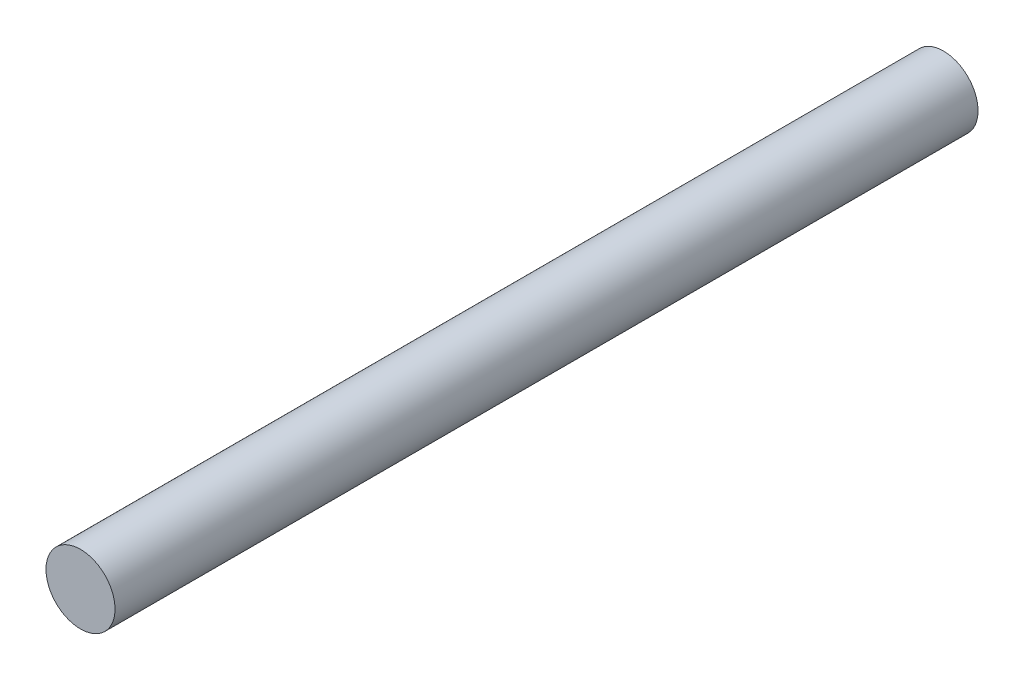
ISO-10303-21;
HEADER;
FILE_DESCRIPTION(('STEP AP214'),'2;1');
FILE_NAME('part.step','',(''),(''),'','','');
FILE_SCHEMA(('AUTOMOTIVE_DESIGN { 1 0 10303 214 1 1 1 1 }'));
ENDSEC;
DATA;
#1=APPLICATION_CONTEXT('core data for automotive mechanical design processes');
#2=APPLICATION_PROTOCOL_DEFINITION('international standard','automotive_design',2000,#1);
#3=PRODUCT_CONTEXT('',#1,'mechanical');
#4=PRODUCT('Part','Part','',(#3));
#5=PRODUCT_RELATED_PRODUCT_CATEGORY('part','',(#4));
#6=PRODUCT_DEFINITION_FORMATION('','',#4);
#7=PRODUCT_DEFINITION_CONTEXT('part definition',#1,'design');
#8=PRODUCT_DEFINITION('design','',#6,#7);
#9=PRODUCT_DEFINITION_SHAPE('','',#8);
#10=(LENGTH_UNIT() NAMED_UNIT(*) SI_UNIT(.MILLI.,.METRE.));
#11=(NAMED_UNIT(*) PLANE_ANGLE_UNIT() SI_UNIT($,.RADIAN.));
#12=(NAMED_UNIT(*) SI_UNIT($,.STERADIAN.) SOLID_ANGLE_UNIT());
#13=UNCERTAINTY_MEASURE_WITH_UNIT(LENGTH_MEASURE(1.E-05),#10,'distance_accuracy_value','');
#14=(GEOMETRIC_REPRESENTATION_CONTEXT(3) GLOBAL_UNCERTAINTY_ASSIGNED_CONTEXT((#13)) GLOBAL_UNIT_ASSIGNED_CONTEXT((#10,
#11,#12)) REPRESENTATION_CONTEXT('',''));
#15=CARTESIAN_POINT('',(0.,0.,0.));
#16=DIRECTION('',(0.,0.,1.));
#17=DIRECTION('',(1.,0.,0.));
#18=AXIS2_PLACEMENT_3D('',#15,#16,#17);
#19=CARTESIAN_POINT('',(0.2999994,0.,0.));
#20=DIRECTION('',(0.,0.,-1.));
#21=DIRECTION('',(-1.,0.,0.));
#22=AXIS2_PLACEMENT_3D('',#19,#20,#21);
#23=PLANE('',#22);
#24=CARTESIAN_POINT('',(0.,0.,0.));
#25=DIRECTION('',(0.,0.,-1.));
#26=DIRECTION('',(-1.,0.,0.));
#27=AXIS2_PLACEMENT_3D('',#24,#25,#26);
#28=CIRCLE('',#27,0.2999994);
#29=CARTESIAN_POINT('',(-0.2999994,0.,0.));
#30=VERTEX_POINT('',#29);
#31=EDGE_CURVE('E17',#30,#30,#28,.F.);
#32=ORIENTED_EDGE('',*,*,#31,.F.);
#33=EDGE_LOOP('',(#32));
#34=FACE_BOUND('',#33,.T.);
#35=ADVANCED_FACE('F14',(#34),#23,.T.);
#36=CARTESIAN_POINT('',(0.2999994,0.,7.50000024));
#37=DIRECTION('',(0.,0.,-1.));
#38=DIRECTION('',(-1.,0.,0.));
#39=AXIS2_PLACEMENT_3D('',#36,#37,#38);
#40=PLANE('',#39);
#41=CARTESIAN_POINT('',(0.,0.,7.50000024));
#42=DIRECTION('',(0.,0.,-1.));
#43=DIRECTION('',(-1.,0.,0.));
#44=AXIS2_PLACEMENT_3D('',#41,#42,#43);
#45=CIRCLE('',#44,0.2999994);
#46=CARTESIAN_POINT('',(-0.2999994,0.,7.50000024));
#47=VERTEX_POINT('',#46);
#48=EDGE_CURVE('E10',#47,#47,#45,.T.);
#49=ORIENTED_EDGE('',*,*,#48,.F.);
#50=EDGE_LOOP('',(#49));
#51=FACE_BOUND('',#50,.T.);
#52=ADVANCED_FACE('F29',(#51),#40,.F.);
#53=CARTESIAN_POINT('',(0.,0.,0.));
#54=DIRECTION('',(0.,0.,-1.));
#55=DIRECTION('',(-1.,0.,0.));
#56=AXIS2_PLACEMENT_3D('',#53,#54,#55);
#57=CYLINDRICAL_SURFACE('',#56,0.2999994);
#58=ORIENTED_EDGE('',*,*,#48,.T.);
#59=EDGE_LOOP('',(#58));
#60=FACE_BOUND('',#59,.T.);
#61=ORIENTED_EDGE('',*,*,#31,.T.);
#62=EDGE_LOOP('',(#61));
#63=FACE_BOUND('',#62,.T.);
#64=ADVANCED_FACE('F26',(#60,#63),#57,.T.);
#65=CLOSED_SHELL('',(#35,#52,#64));
#66=MANIFOLD_SOLID_BREP('B1',#65);
#67=ADVANCED_BREP_SHAPE_REPRESENTATION('',(#18,#66),#14);
#68=SHAPE_DEFINITION_REPRESENTATION(#9,#67);
ENDSEC;
END-ISO-10303-21;
